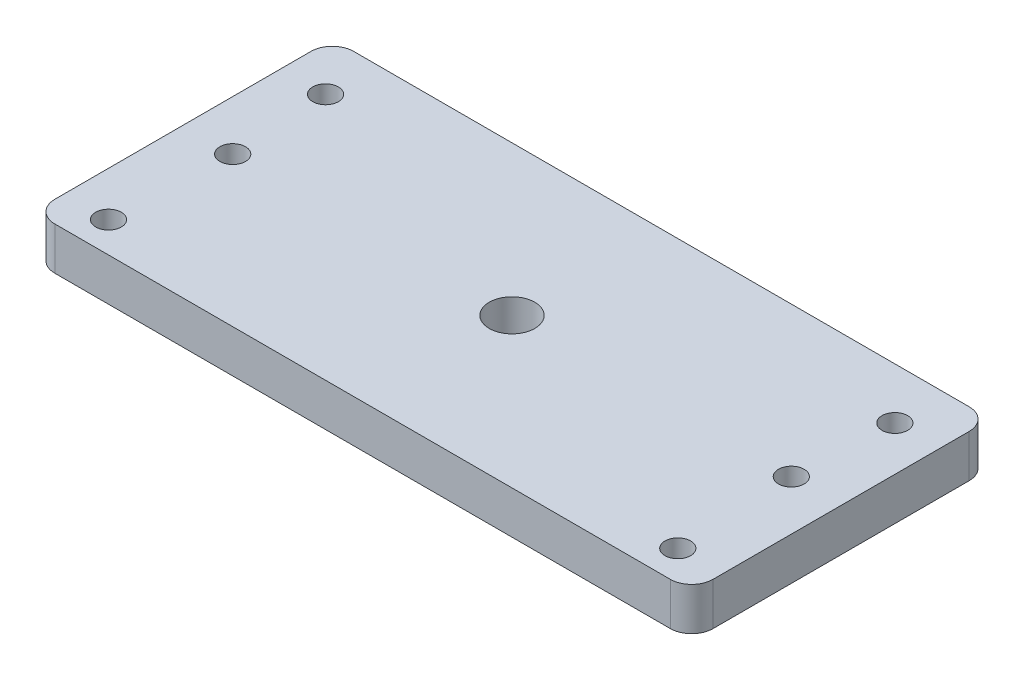
ISO-10303-21;
HEADER;
FILE_DESCRIPTION(('STEP AP214'),'2;1');
FILE_NAME('part.step','',(''),(''),'','','');
FILE_SCHEMA(('AUTOMOTIVE_DESIGN { 1 0 10303 214 1 1 1 1 }'));
ENDSEC;
DATA;
#1=APPLICATION_CONTEXT('core data for automotive mechanical design processes');
#2=APPLICATION_PROTOCOL_DEFINITION('international standard','automotive_design',2000,#1);
#3=PRODUCT_CONTEXT('',#1,'mechanical');
#4=PRODUCT('Part','Part','',(#3));
#5=PRODUCT_RELATED_PRODUCT_CATEGORY('part','',(#4));
#6=PRODUCT_DEFINITION_FORMATION('','',#4);
#7=PRODUCT_DEFINITION_CONTEXT('part definition',#1,'design');
#8=PRODUCT_DEFINITION('design','',#6,#7);
#9=PRODUCT_DEFINITION_SHAPE('','',#8);
#10=(LENGTH_UNIT() NAMED_UNIT(*) SI_UNIT(.MILLI.,.METRE.));
#11=(NAMED_UNIT(*) PLANE_ANGLE_UNIT() SI_UNIT($,.RADIAN.));
#12=(NAMED_UNIT(*) SI_UNIT($,.STERADIAN.) SOLID_ANGLE_UNIT());
#13=UNCERTAINTY_MEASURE_WITH_UNIT(LENGTH_MEASURE(1.E-05),#10,'distance_accuracy_value','');
#14=(GEOMETRIC_REPRESENTATION_CONTEXT(3) GLOBAL_UNCERTAINTY_ASSIGNED_CONTEXT((#13)) GLOBAL_UNIT_ASSIGNED_CONTEXT((#10,
#11,#12)) REPRESENTATION_CONTEXT('',''));
#15=CARTESIAN_POINT('',(0.,0.,0.));
#16=DIRECTION('',(0.,0.,1.));
#17=DIRECTION('',(1.,0.,0.));
#18=AXIS2_PLACEMENT_3D('',#15,#16,#17);
#19=CARTESIAN_POINT('',(0.,0.,0.));
#20=DIRECTION('',(0.,1.,0.));
#21=DIRECTION('',(0.,0.,1.));
#22=AXIS2_PLACEMENT_3D('',#19,#20,#21);
#23=PLANE('',#22);
#24=CARTESIAN_POINT('',(59.5033388859809,0.,-13.7153435773295));
#25=DIRECTION('',(0.,-1.,0.));
#26=DIRECTION('',(0.,0.,-1.));
#27=AXIS2_PLACEMENT_3D('',#24,#25,#26);
#28=CIRCLE('',#27,3.46999999999999);
#29=CARTESIAN_POINT('',(59.5033388859809,0.,-17.1853435773295));
#30=VERTEX_POINT('',#29);
#31=EDGE_CURVE('E234',#30,#30,#28,.T.);
#32=ORIENTED_EDGE('',*,*,#31,.F.);
#33=EDGE_LOOP('',(#32));
#34=FACE_BOUND('',#33,.T.);
#35=CARTESIAN_POINT('',(-18.9966611140192,0.,-13.7153435773295));
#36=DIRECTION('',(0.,-1.,0.));
#37=DIRECTION('',(0.,0.,-1.));
#38=AXIS2_PLACEMENT_3D('',#35,#36,#37);
#39=CIRCLE('',#38,3.47);
#40=CARTESIAN_POINT('',(-18.9966611140192,0.,-17.1853435773295));
#41=VERTEX_POINT('',#40);
#42=EDGE_CURVE('E225',#41,#41,#39,.T.);
#43=ORIENTED_EDGE('',*,*,#42,.F.);
#44=EDGE_LOOP('',(#43));
#45=FACE_BOUND('',#44,.T.);
#46=CARTESIAN_POINT('',(20.2533388859809,0.,-13.7153435773295));
#47=DIRECTION('',(0.,1.,0.));
#48=DIRECTION('',(0.,0.,1.));
#49=AXIS2_PLACEMENT_3D('',#46,#47,#48);
#50=CIRCLE('',#49,10.2);
#51=CARTESIAN_POINT('',(20.2533388859809,0.,-3.51534357732952));
#52=VERTEX_POINT('',#51);
#53=EDGE_CURVE('E149',#52,#52,#50,.T.);
#54=ORIENTED_EDGE('',*,*,#53,.T.);
#55=EDGE_LOOP('',(#54));
#56=FACE_BOUND('',#55,.T.);
#57=DIRECTION('',(0.,0.,1.));
#58=VECTOR('',#57,1.);
#59=CARTESIAN_POINT('',(-25.9966611140191,0.,-34.7153435773295));
#60=LINE('',#59,#58);
#61=CARTESIAN_POINT('',(-25.9966611140191,0.,-31.7153435773295));
#62=VERTEX_POINT('',#61);
#63=CARTESIAN_POINT('',(-25.9966611140191,0.,4.28465642267049));
#64=VERTEX_POINT('',#63);
#65=EDGE_CURVE('E124',#62,#64,#60,.T.);
#66=ORIENTED_EDGE('',*,*,#65,.F.);
#67=CARTESIAN_POINT('',(-22.9966611140191,0.,-31.7153435773295));
#68=DIRECTION('',(0.,1.,0.));
#69=DIRECTION('',(0.,0.,1.));
#70=AXIS2_PLACEMENT_3D('',#67,#68,#69);
#71=CIRCLE('',#70,3.);
#72=CARTESIAN_POINT('',(-22.9966611140191,0.,-34.7153435773295));
#73=VERTEX_POINT('',#72);
#74=EDGE_CURVE('E107',#62,#73,#71,.F.);
#75=ORIENTED_EDGE('',*,*,#74,.T.);
#76=DIRECTION('',(-1.,0.,0.));
#77=VECTOR('',#76,1.);
#78=CARTESIAN_POINT('',(-25.9966611140191,0.,-34.7153435773295));
#79=LINE('',#78,#77);
#80=CARTESIAN_POINT('',(63.5033388859809,0.,-34.7153435773295));
#81=VERTEX_POINT('',#80);
#82=EDGE_CURVE('E147',#81,#73,#79,.T.);
#83=ORIENTED_EDGE('',*,*,#82,.F.);
#84=CARTESIAN_POINT('',(63.5033388859809,0.,-31.7153435773295));
#85=DIRECTION('',(0.,1.,0.));
#86=DIRECTION('',(0.,0.,1.));
#87=AXIS2_PLACEMENT_3D('',#84,#85,#86);
#88=CIRCLE('',#87,3.);
#89=CARTESIAN_POINT('',(66.5033388859809,0.,-31.7153435773295));
#90=VERTEX_POINT('',#89);
#91=EDGE_CURVE('E128',#81,#90,#88,.F.);
#92=ORIENTED_EDGE('',*,*,#91,.T.);
#93=DIRECTION('',(0.,0.,-1.));
#94=VECTOR('',#93,1.);
#95=CARTESIAN_POINT('',(66.5033388859809,0.,-34.7153435773295));
#96=LINE('',#95,#94);
#97=CARTESIAN_POINT('',(66.5033388859809,0.,4.28465642267048));
#98=VERTEX_POINT('',#97);
#99=EDGE_CURVE('E137',#98,#90,#96,.T.);
#100=ORIENTED_EDGE('',*,*,#99,.F.);
#101=CARTESIAN_POINT('',(63.5033388859809,0.,4.28465642267048));
#102=DIRECTION('',(0.,1.,0.));
#103=DIRECTION('',(0.,0.,1.));
#104=AXIS2_PLACEMENT_3D('',#101,#102,#103);
#105=CIRCLE('',#104,3.);
#106=CARTESIAN_POINT('',(63.5033388859809,0.,7.28465642267049));
#107=VERTEX_POINT('',#106);
#108=EDGE_CURVE('E154',#98,#107,#105,.F.);
#109=ORIENTED_EDGE('',*,*,#108,.T.);
#110=DIRECTION('',(1.,0.,0.));
#111=VECTOR('',#110,1.);
#112=CARTESIAN_POINT('',(-25.9966611140191,0.,7.2846564226705));
#113=LINE('',#112,#111);
#114=CARTESIAN_POINT('',(-22.9966611140191,0.,7.2846564226705));
#115=VERTEX_POINT('',#114);
#116=EDGE_CURVE('E133',#115,#107,#113,.T.);
#117=ORIENTED_EDGE('',*,*,#116,.F.);
#118=CARTESIAN_POINT('',(-22.9966611140191,0.,4.2846564226705));
#119=DIRECTION('',(0.,1.,0.));
#120=DIRECTION('',(0.,0.,1.));
#121=AXIS2_PLACEMENT_3D('',#118,#119,#120);
#122=CIRCLE('',#121,3.);
#123=EDGE_CURVE('E118',#115,#64,#122,.F.);
#124=ORIENTED_EDGE('',*,*,#123,.T.);
#125=EDGE_LOOP('',(#66,#75,#83,#92,#100,#109,#117,#124));
#126=FACE_BOUND('',#125,.T.);
#127=CARTESIAN_POINT('',(-19.746661114016,0.,-27.5153435773319));
#128=DIRECTION('',(0.,-1.,0.));
#129=DIRECTION('',(0.,0.,-1.));
#130=AXIS2_PLACEMENT_3D('',#127,#128,#129);
#131=CIRCLE('',#130,1.8);
#132=CARTESIAN_POINT('',(-19.746661114016,0.,-29.3153435773319));
#133=VERTEX_POINT('',#132);
#134=EDGE_CURVE('E192',#133,#133,#131,.T.);
#135=ORIENTED_EDGE('',*,*,#134,.F.);
#136=EDGE_LOOP('',(#135));
#137=FACE_BOUND('',#136,.T.);
#138=CARTESIAN_POINT('',(-19.7466611140159,0.,2.98465642266812));
#139=DIRECTION('',(0.,-1.,0.));
#140=DIRECTION('',(0.,0.,-1.));
#141=AXIS2_PLACEMENT_3D('',#138,#139,#140);
#142=CIRCLE('',#141,1.8);
#143=CARTESIAN_POINT('',(-19.7466611140159,0.,1.18465642266812));
#144=VERTEX_POINT('',#143);
#145=EDGE_CURVE('E198',#144,#144,#142,.T.);
#146=ORIENTED_EDGE('',*,*,#145,.F.);
#147=EDGE_LOOP('',(#146));
#148=FACE_BOUND('',#147,.T.);
#149=CARTESIAN_POINT('',(60.2533388859841,0.,2.98465642266775));
#150=DIRECTION('',(0.,-1.,0.));
#151=DIRECTION('',(0.,0.,-1.));
#152=AXIS2_PLACEMENT_3D('',#149,#150,#151);
#153=CIRCLE('',#152,1.8);
#154=CARTESIAN_POINT('',(60.2533388859841,0.,1.18465642266775));
#155=VERTEX_POINT('',#154);
#156=EDGE_CURVE('E204',#155,#155,#153,.T.);
#157=ORIENTED_EDGE('',*,*,#156,.F.);
#158=EDGE_LOOP('',(#157));
#159=FACE_BOUND('',#158,.T.);
#160=CARTESIAN_POINT('',(60.253338885984,0.,-27.5153435773322));
#161=DIRECTION('',(0.,-1.,0.));
#162=DIRECTION('',(0.,0.,-1.));
#163=AXIS2_PLACEMENT_3D('',#160,#161,#162);
#164=CIRCLE('',#163,1.8);
#165=CARTESIAN_POINT('',(60.253338885984,0.,-29.3153435773322));
#166=VERTEX_POINT('',#165);
#167=EDGE_CURVE('E210',#166,#166,#164,.T.);
#168=ORIENTED_EDGE('',*,*,#167,.F.);
#169=EDGE_LOOP('',(#168));
#170=FACE_BOUND('',#169,.T.);
#171=ADVANCED_FACE('F41',(#34,#45,#56,#126,#137,#148,#159,#170),#23,.F.);
#172=CARTESIAN_POINT('',(0.,6.,0.));
#173=DIRECTION('',(0.,1.,0.));
#174=DIRECTION('',(0.,0.,1.));
#175=AXIS2_PLACEMENT_3D('',#172,#173,#174);
#176=PLANE('',#175);
#177=CARTESIAN_POINT('',(59.5033388859809,6.,-13.7153435773295));
#178=DIRECTION('',(0.,-1.,0.));
#179=DIRECTION('',(0.,0.,-1.));
#180=AXIS2_PLACEMENT_3D('',#177,#178,#179);
#181=CIRCLE('',#180,1.8);
#182=CARTESIAN_POINT('',(59.5033388859809,6.,-15.5153435773295));
#183=VERTEX_POINT('',#182);
#184=EDGE_CURVE('E228',#183,#183,#181,.T.);
#185=ORIENTED_EDGE('',*,*,#184,.T.);
#186=EDGE_LOOP('',(#185));
#187=FACE_BOUND('',#186,.T.);
#188=CARTESIAN_POINT('',(-18.9966611140192,6.,-13.7153435773295));
#189=DIRECTION('',(0.,-1.,0.));
#190=DIRECTION('',(0.,0.,-1.));
#191=AXIS2_PLACEMENT_3D('',#188,#189,#190);
#192=CIRCLE('',#191,1.8);
#193=CARTESIAN_POINT('',(-18.9966611140192,6.,-15.5153435773295));
#194=VERTEX_POINT('',#193);
#195=EDGE_CURVE('E219',#194,#194,#192,.T.);
#196=ORIENTED_EDGE('',*,*,#195,.T.);
#197=EDGE_LOOP('',(#196));
#198=FACE_BOUND('',#197,.T.);
#199=CARTESIAN_POINT('',(60.253338885984,6.,-27.5153435773322));
#200=DIRECTION('',(0.,1.,0.));
#201=DIRECTION('',(0.,0.,1.));
#202=AXIS2_PLACEMENT_3D('',#199,#200,#201);
#203=CIRCLE('',#202,1.8);
#204=CARTESIAN_POINT('',(60.253338885984,6.,-25.7153435773322));
#205=VERTEX_POINT('',#204);
#206=EDGE_CURVE('E207',#205,#205,#203,.T.);
#207=ORIENTED_EDGE('',*,*,#206,.F.);
#208=EDGE_LOOP('',(#207));
#209=FACE_BOUND('',#208,.T.);
#210=CARTESIAN_POINT('',(60.2533388859841,6.,2.98465642266775));
#211=DIRECTION('',(0.,1.,0.));
#212=DIRECTION('',(0.,0.,1.));
#213=AXIS2_PLACEMENT_3D('',#210,#211,#212);
#214=CIRCLE('',#213,1.8);
#215=CARTESIAN_POINT('',(60.2533388859841,6.,4.78465642266775));
#216=VERTEX_POINT('',#215);
#217=EDGE_CURVE('E201',#216,#216,#214,.T.);
#218=ORIENTED_EDGE('',*,*,#217,.F.);
#219=EDGE_LOOP('',(#218));
#220=FACE_BOUND('',#219,.T.);
#221=CARTESIAN_POINT('',(-19.7466611140159,6.,2.98465642266812));
#222=DIRECTION('',(0.,1.,0.));
#223=DIRECTION('',(0.,0.,1.));
#224=AXIS2_PLACEMENT_3D('',#221,#222,#223);
#225=CIRCLE('',#224,1.8);
#226=CARTESIAN_POINT('',(-19.7466611140159,6.,4.78465642266812));
#227=VERTEX_POINT('',#226);
#228=EDGE_CURVE('E195',#227,#227,#225,.T.);
#229=ORIENTED_EDGE('',*,*,#228,.F.);
#230=EDGE_LOOP('',(#229));
#231=FACE_BOUND('',#230,.T.);
#232=CARTESIAN_POINT('',(-19.746661114016,6.,-27.5153435773319));
#233=DIRECTION('',(0.,1.,0.));
#234=DIRECTION('',(0.,0.,1.));
#235=AXIS2_PLACEMENT_3D('',#232,#233,#234);
#236=CIRCLE('',#235,1.8);
#237=CARTESIAN_POINT('',(-19.746661114016,6.,-25.7153435773319));
#238=VERTEX_POINT('',#237);
#239=EDGE_CURVE('E140',#238,#238,#236,.T.);
#240=ORIENTED_EDGE('',*,*,#239,.F.);
#241=EDGE_LOOP('',(#240));
#242=FACE_BOUND('',#241,.T.);
#243=DIRECTION('',(-1.,0.,0.));
#244=VECTOR('',#243,1.);
#245=CARTESIAN_POINT('',(-25.9966611140191,6.,-34.7153435773295));
#246=LINE('',#245,#244);
#247=CARTESIAN_POINT('',(63.5033388859809,6.,-34.7153435773295));
#248=VERTEX_POINT('',#247);
#249=CARTESIAN_POINT('',(-22.9966611140191,6.,-34.7153435773295));
#250=VERTEX_POINT('',#249);
#251=EDGE_CURVE('E143',#248,#250,#246,.T.);
#252=ORIENTED_EDGE('',*,*,#251,.T.);
#253=CARTESIAN_POINT('',(-22.9966611140191,6.,-31.7153435773295));
#254=DIRECTION('',(0.,1.,0.));
#255=DIRECTION('',(0.,0.,1.));
#256=AXIS2_PLACEMENT_3D('',#253,#254,#255);
#257=CIRCLE('',#256,3.);
#258=CARTESIAN_POINT('',(-25.9966611140191,6.,-31.7153435773295));
#259=VERTEX_POINT('',#258);
#260=EDGE_CURVE('E165',#250,#259,#257,.T.);
#261=ORIENTED_EDGE('',*,*,#260,.T.);
#262=DIRECTION('',(0.,0.,1.));
#263=VECTOR('',#262,1.);
#264=CARTESIAN_POINT('',(-25.9966611140191,6.,-34.7153435773295));
#265=LINE('',#264,#263);
#266=CARTESIAN_POINT('',(-25.9966611140191,6.,4.28465642267049));
#267=VERTEX_POINT('',#266);
#268=EDGE_CURVE('E127',#259,#267,#265,.T.);
#269=ORIENTED_EDGE('',*,*,#268,.T.);
#270=CARTESIAN_POINT('',(-22.9966611140191,6.,4.2846564226705));
#271=DIRECTION('',(0.,1.,0.));
#272=DIRECTION('',(0.,0.,1.));
#273=AXIS2_PLACEMENT_3D('',#270,#271,#272);
#274=CIRCLE('',#273,3.);
#275=CARTESIAN_POINT('',(-22.9966611140191,6.,7.2846564226705));
#276=VERTEX_POINT('',#275);
#277=EDGE_CURVE('E163',#267,#276,#274,.T.);
#278=ORIENTED_EDGE('',*,*,#277,.T.);
#279=DIRECTION('',(1.,0.,0.));
#280=VECTOR('',#279,1.);
#281=CARTESIAN_POINT('',(-25.9966611140191,6.,7.2846564226705));
#282=LINE('',#281,#280);
#283=CARTESIAN_POINT('',(63.5033388859809,6.,7.28465642267049));
#284=VERTEX_POINT('',#283);
#285=EDGE_CURVE('E176',#276,#284,#282,.T.);
#286=ORIENTED_EDGE('',*,*,#285,.T.);
#287=CARTESIAN_POINT('',(63.5033388859809,6.,4.28465642267048));
#288=DIRECTION('',(0.,1.,0.));
#289=DIRECTION('',(0.,0.,1.));
#290=AXIS2_PLACEMENT_3D('',#287,#288,#289);
#291=CIRCLE('',#290,3.);
#292=CARTESIAN_POINT('',(66.5033388859809,6.,4.28465642267048));
#293=VERTEX_POINT('',#292);
#294=EDGE_CURVE('E62',#284,#293,#291,.T.);
#295=ORIENTED_EDGE('',*,*,#294,.T.);
#296=DIRECTION('',(0.,0.,-1.));
#297=VECTOR('',#296,1.);
#298=CARTESIAN_POINT('',(66.5033388859809,6.,-34.7153435773295));
#299=LINE('',#298,#297);
#300=CARTESIAN_POINT('',(66.5033388859809,6.,-31.7153435773295));
#301=VERTEX_POINT('',#300);
#302=EDGE_CURVE('E184',#293,#301,#299,.T.);
#303=ORIENTED_EDGE('',*,*,#302,.T.);
#304=CARTESIAN_POINT('',(63.5033388859809,6.,-31.7153435773295));
#305=DIRECTION('',(0.,1.,0.));
#306=DIRECTION('',(0.,0.,1.));
#307=AXIS2_PLACEMENT_3D('',#304,#305,#306);
#308=CIRCLE('',#307,3.);
#309=EDGE_CURVE('E160',#301,#248,#308,.T.);
#310=ORIENTED_EDGE('',*,*,#309,.T.);
#311=EDGE_LOOP('',(#252,#261,#269,#278,#286,#295,#303,#310));
#312=FACE_BOUND('',#311,.T.);
#313=CARTESIAN_POINT('',(20.2533388859809,6.,-13.7153435773295));
#314=DIRECTION('',(0.,1.,0.));
#315=DIRECTION('',(0.,0.,1.));
#316=AXIS2_PLACEMENT_3D('',#313,#314,#315);
#317=CIRCLE('',#316,3.2);
#318=CARTESIAN_POINT('',(20.2533388859809,6.,-10.5153435773295));
#319=VERTEX_POINT('',#318);
#320=EDGE_CURVE('E134',#319,#319,#317,.T.);
#321=ORIENTED_EDGE('',*,*,#320,.F.);
#322=EDGE_LOOP('',(#321));
#323=FACE_BOUND('',#322,.T.);
#324=ADVANCED_FACE('F242',(#187,#198,#209,#220,#231,#242,#312,#323),#176,.T.);
#325=CARTESIAN_POINT('',(-25.9966611140191,6.,-34.7153435773295));
#326=DIRECTION('',(1.,0.,0.));
#327=DIRECTION('',(0.,0.,-1.));
#328=AXIS2_PLACEMENT_3D('',#325,#326,#327);
#329=PLANE('',#328);
#330=ORIENTED_EDGE('',*,*,#268,.F.);
#331=DIRECTION('',(0.,-1.,0.));
#332=VECTOR('',#331,1.);
#333=CARTESIAN_POINT('',(-25.9966611140191,6.,-31.7153435773295));
#334=LINE('',#333,#332);
#335=EDGE_CURVE('E111',#259,#62,#334,.T.);
#336=ORIENTED_EDGE('',*,*,#335,.T.);
#337=ORIENTED_EDGE('',*,*,#65,.T.);
#338=DIRECTION('',(0.,-1.,0.));
#339=VECTOR('',#338,1.);
#340=CARTESIAN_POINT('',(-25.9966611140191,6.,4.28465642267049));
#341=LINE('',#340,#339);
#342=EDGE_CURVE('E129',#64,#267,#341,.F.);
#343=ORIENTED_EDGE('',*,*,#342,.T.);
#344=EDGE_LOOP('',(#330,#336,#337,#343));
#345=FACE_BOUND('',#344,.T.);
#346=ADVANCED_FACE('F123',(#345),#329,.F.);
#347=CARTESIAN_POINT('',(-25.9966611140191,6.,7.2846564226705));
#348=DIRECTION('',(0.,0.,-1.));
#349=DIRECTION('',(-1.,0.,0.));
#350=AXIS2_PLACEMENT_3D('',#347,#348,#349);
#351=PLANE('',#350);
#352=ORIENTED_EDGE('',*,*,#285,.F.);
#353=DIRECTION('',(0.,-1.,0.));
#354=VECTOR('',#353,1.);
#355=CARTESIAN_POINT('',(-22.9966611140191,6.,7.2846564226705));
#356=LINE('',#355,#354);
#357=EDGE_CURVE('E169',#276,#115,#356,.T.);
#358=ORIENTED_EDGE('',*,*,#357,.T.);
#359=ORIENTED_EDGE('',*,*,#116,.T.);
#360=DIRECTION('',(0.,-1.,0.));
#361=VECTOR('',#360,1.);
#362=CARTESIAN_POINT('',(63.5033388859809,6.,7.28465642267049));
#363=LINE('',#362,#361);
#364=EDGE_CURVE('E167',#107,#284,#363,.F.);
#365=ORIENTED_EDGE('',*,*,#364,.T.);
#366=EDGE_LOOP('',(#352,#358,#359,#365));
#367=FACE_BOUND('',#366,.T.);
#368=ADVANCED_FACE('F174',(#367),#351,.F.);
#369=CARTESIAN_POINT('',(66.5033388859809,6.,-34.7153435773295));
#370=DIRECTION('',(-1.,0.,0.));
#371=DIRECTION('',(0.,0.,1.));
#372=AXIS2_PLACEMENT_3D('',#369,#370,#371);
#373=PLANE('',#372);
#374=ORIENTED_EDGE('',*,*,#302,.F.);
#375=DIRECTION('',(0.,-1.,0.));
#376=VECTOR('',#375,1.);
#377=CARTESIAN_POINT('',(66.5033388859809,6.,4.28465642267048));
#378=LINE('',#377,#376);
#379=EDGE_CURVE('E11',#293,#98,#378,.T.);
#380=ORIENTED_EDGE('',*,*,#379,.T.);
#381=ORIENTED_EDGE('',*,*,#99,.T.);
#382=DIRECTION('',(0.,-1.,0.));
#383=VECTOR('',#382,1.);
#384=CARTESIAN_POINT('',(66.5033388859809,6.,-31.7153435773295));
#385=LINE('',#384,#383);
#386=EDGE_CURVE('E49',#90,#301,#385,.F.);
#387=ORIENTED_EDGE('',*,*,#386,.T.);
#388=EDGE_LOOP('',(#374,#380,#381,#387));
#389=FACE_BOUND('',#388,.T.);
#390=ADVANCED_FACE('F183',(#389),#373,.F.);
#391=CARTESIAN_POINT('',(-25.9966611140191,6.,-34.7153435773295));
#392=DIRECTION('',(0.,0.,1.));
#393=DIRECTION('',(1.,0.,0.));
#394=AXIS2_PLACEMENT_3D('',#391,#392,#393);
#395=PLANE('',#394);
#396=ORIENTED_EDGE('',*,*,#82,.T.);
#397=DIRECTION('',(0.,-1.,0.));
#398=VECTOR('',#397,1.);
#399=CARTESIAN_POINT('',(-22.9966611140191,6.,-34.7153435773295));
#400=LINE('',#399,#398);
#401=EDGE_CURVE('E112',#73,#250,#400,.F.);
#402=ORIENTED_EDGE('',*,*,#401,.T.);
#403=ORIENTED_EDGE('',*,*,#251,.F.);
#404=DIRECTION('',(0.,-1.,0.));
#405=VECTOR('',#404,1.);
#406=CARTESIAN_POINT('',(63.5033388859809,6.,-34.7153435773295));
#407=LINE('',#406,#405);
#408=EDGE_CURVE('E117',#248,#81,#407,.T.);
#409=ORIENTED_EDGE('',*,*,#408,.T.);
#410=EDGE_LOOP('',(#396,#402,#403,#409));
#411=FACE_BOUND('',#410,.T.);
#412=ADVANCED_FACE('F264',(#411),#395,.F.);
#413=CARTESIAN_POINT('',(20.2533388859809,6.,-13.7153435773295));
#414=DIRECTION('',(0.,-1.,0.));
#415=DIRECTION('',(0.,0.,-1.));
#416=AXIS2_PLACEMENT_3D('',#413,#414,#415);
#417=CYLINDRICAL_SURFACE('',#416,3.2);
#418=ORIENTED_EDGE('',*,*,#320,.T.);
#419=EDGE_LOOP('',(#418));
#420=FACE_BOUND('',#419,.T.);
#421=CARTESIAN_POINT('',(20.2533388859809,-3.,-13.7153435773295));
#422=DIRECTION('',(0.,-1.,0.));
#423=DIRECTION('',(0.,0.,-1.));
#424=AXIS2_PLACEMENT_3D('',#421,#422,#423);
#425=CIRCLE('',#424,3.2);
#426=CARTESIAN_POINT('',(20.2533388859809,-3.,-16.9153435773295));
#427=VERTEX_POINT('',#426);
#428=EDGE_CURVE('E216',#427,#427,#425,.T.);
#429=ORIENTED_EDGE('',*,*,#428,.T.);
#430=EDGE_LOOP('',(#429));
#431=FACE_BOUND('',#430,.T.);
#432=ADVANCED_FACE('F261',(#420,#431),#417,.F.);
#433=CARTESIAN_POINT('',(-19.746661114016,0.,-27.5153435773319));
#434=DIRECTION('',(0.,-1.,0.));
#435=DIRECTION('',(0.,0.,-1.));
#436=AXIS2_PLACEMENT_3D('',#433,#434,#435);
#437=CYLINDRICAL_SURFACE('',#436,1.8);
#438=ORIENTED_EDGE('',*,*,#239,.T.);
#439=EDGE_LOOP('',(#438));
#440=FACE_BOUND('',#439,.T.);
#441=ORIENTED_EDGE('',*,*,#134,.T.);
#442=EDGE_LOOP('',(#441));
#443=FACE_BOUND('',#442,.T.);
#444=ADVANCED_FACE('F263',(#440,#443),#437,.F.);
#445=CARTESIAN_POINT('',(-19.7466611140159,0.,2.98465642266812));
#446=DIRECTION('',(0.,-1.,0.));
#447=DIRECTION('',(0.,0.,-1.));
#448=AXIS2_PLACEMENT_3D('',#445,#446,#447);
#449=CYLINDRICAL_SURFACE('',#448,1.8);
#450=ORIENTED_EDGE('',*,*,#228,.T.);
#451=EDGE_LOOP('',(#450));
#452=FACE_BOUND('',#451,.T.);
#453=ORIENTED_EDGE('',*,*,#145,.T.);
#454=EDGE_LOOP('',(#453));
#455=FACE_BOUND('',#454,.T.);
#456=ADVANCED_FACE('F271',(#452,#455),#449,.F.);
#457=CARTESIAN_POINT('',(60.2533388859841,0.,2.98465642266775));
#458=DIRECTION('',(0.,-1.,0.));
#459=DIRECTION('',(0.,0.,-1.));
#460=AXIS2_PLACEMENT_3D('',#457,#458,#459);
#461=CYLINDRICAL_SURFACE('',#460,1.8);
#462=ORIENTED_EDGE('',*,*,#217,.T.);
#463=EDGE_LOOP('',(#462));
#464=FACE_BOUND('',#463,.T.);
#465=ORIENTED_EDGE('',*,*,#156,.T.);
#466=EDGE_LOOP('',(#465));
#467=FACE_BOUND('',#466,.T.);
#468=ADVANCED_FACE('F322',(#464,#467),#461,.F.);
#469=CARTESIAN_POINT('',(60.253338885984,0.,-27.5153435773322));
#470=DIRECTION('',(0.,-1.,0.));
#471=DIRECTION('',(0.,0.,-1.));
#472=AXIS2_PLACEMENT_3D('',#469,#470,#471);
#473=CYLINDRICAL_SURFACE('',#472,1.8);
#474=ORIENTED_EDGE('',*,*,#206,.T.);
#475=EDGE_LOOP('',(#474));
#476=FACE_BOUND('',#475,.T.);
#477=ORIENTED_EDGE('',*,*,#167,.T.);
#478=EDGE_LOOP('',(#477));
#479=FACE_BOUND('',#478,.T.);
#480=ADVANCED_FACE('F257',(#476,#479),#473,.F.);
#481=CARTESIAN_POINT('',(20.2533388859809,-3.,-13.7153435773295));
#482=DIRECTION('',(0.,-1.,0.));
#483=DIRECTION('',(0.,0.,-1.));
#484=AXIS2_PLACEMENT_3D('',#481,#482,#483);
#485=PLANE('',#484);
#486=CARTESIAN_POINT('',(20.2533388859809,-3.,-13.7153435773295));
#487=DIRECTION('',(0.,-1.,0.));
#488=DIRECTION('',(0.,0.,-1.));
#489=AXIS2_PLACEMENT_3D('',#486,#487,#488);
#490=CIRCLE('',#489,7.2);
#491=CARTESIAN_POINT('',(20.2533388859809,-3.,-20.9153435773295));
#492=VERTEX_POINT('',#491);
#493=EDGE_CURVE('E213',#492,#492,#490,.T.);
#494=ORIENTED_EDGE('',*,*,#493,.T.);
#495=EDGE_LOOP('',(#494));
#496=FACE_BOUND('',#495,.T.);
#497=ORIENTED_EDGE('',*,*,#428,.F.);
#498=EDGE_LOOP('',(#497));
#499=FACE_BOUND('',#498,.T.);
#500=ADVANCED_FACE('F251',(#496,#499),#485,.T.);
#501=CARTESIAN_POINT('',(20.2533388859809,-3.00000000000001,-13.7153435773295));
#502=DIRECTION('',(0.,1.,0.));
#503=DIRECTION('',(0.,0.,1.));
#504=AXIS2_PLACEMENT_3D('',#501,#502,#503);
#505=CONICAL_SURFACE('',#504,7.2,0.785398163397445);
#506=ORIENTED_EDGE('',*,*,#53,.F.);
#507=EDGE_LOOP('',(#506));
#508=FACE_BOUND('',#507,.T.);
#509=ORIENTED_EDGE('',*,*,#493,.F.);
#510=EDGE_LOOP('',(#509));
#511=FACE_BOUND('',#510,.T.);
#512=ADVANCED_FACE('F248',(#508,#511),#505,.T.);
#513=CARTESIAN_POINT('',(-22.9966611140191,6.,-31.7153435773295));
#514=DIRECTION('',(0.,-1.,0.));
#515=DIRECTION('',(0.,0.,-1.));
#516=AXIS2_PLACEMENT_3D('',#513,#514,#515);
#517=CYLINDRICAL_SURFACE('',#516,3.);
#518=ORIENTED_EDGE('',*,*,#260,.F.);
#519=ORIENTED_EDGE('',*,*,#401,.F.);
#520=ORIENTED_EDGE('',*,*,#74,.F.);
#521=ORIENTED_EDGE('',*,*,#335,.F.);
#522=EDGE_LOOP('',(#518,#519,#520,#521));
#523=FACE_BOUND('',#522,.T.);
#524=ADVANCED_FACE('F110',(#523),#517,.T.);
#525=CARTESIAN_POINT('',(-22.9966611140191,6.,4.2846564226705));
#526=DIRECTION('',(0.,-1.,0.));
#527=DIRECTION('',(0.,0.,-1.));
#528=AXIS2_PLACEMENT_3D('',#525,#526,#527);
#529=CYLINDRICAL_SURFACE('',#528,3.);
#530=ORIENTED_EDGE('',*,*,#277,.F.);
#531=ORIENTED_EDGE('',*,*,#342,.F.);
#532=ORIENTED_EDGE('',*,*,#123,.F.);
#533=ORIENTED_EDGE('',*,*,#357,.F.);
#534=EDGE_LOOP('',(#530,#531,#532,#533));
#535=FACE_BOUND('',#534,.T.);
#536=ADVANCED_FACE('F293',(#535),#529,.T.);
#537=CARTESIAN_POINT('',(63.5033388859809,6.,4.28465642267048));
#538=DIRECTION('',(0.,-1.,0.));
#539=DIRECTION('',(0.,0.,-1.));
#540=AXIS2_PLACEMENT_3D('',#537,#538,#539);
#541=CYLINDRICAL_SURFACE('',#540,3.);
#542=ORIENTED_EDGE('',*,*,#294,.F.);
#543=ORIENTED_EDGE('',*,*,#364,.F.);
#544=ORIENTED_EDGE('',*,*,#108,.F.);
#545=ORIENTED_EDGE('',*,*,#379,.F.);
#546=EDGE_LOOP('',(#542,#543,#544,#545));
#547=FACE_BOUND('',#546,.T.);
#548=ADVANCED_FACE('F182',(#547),#541,.T.);
#549=CARTESIAN_POINT('',(63.5033388859809,6.,-31.7153435773295));
#550=DIRECTION('',(0.,-1.,0.));
#551=DIRECTION('',(0.,0.,-1.));
#552=AXIS2_PLACEMENT_3D('',#549,#550,#551);
#553=CYLINDRICAL_SURFACE('',#552,3.);
#554=ORIENTED_EDGE('',*,*,#309,.F.);
#555=ORIENTED_EDGE('',*,*,#386,.F.);
#556=ORIENTED_EDGE('',*,*,#91,.F.);
#557=ORIENTED_EDGE('',*,*,#408,.F.);
#558=EDGE_LOOP('',(#554,#555,#556,#557));
#559=FACE_BOUND('',#558,.T.);
#560=ADVANCED_FACE('F43',(#559),#553,.T.);
#561=CARTESIAN_POINT('',(-18.9966611140192,0.,-13.7153435773295));
#562=DIRECTION('',(0.,-1.,0.));
#563=DIRECTION('',(0.,0.,-1.));
#564=AXIS2_PLACEMENT_3D('',#561,#562,#563);
#565=CYLINDRICAL_SURFACE('',#564,1.8);
#566=ORIENTED_EDGE('',*,*,#195,.F.);
#567=EDGE_LOOP('',(#566));
#568=FACE_BOUND('',#567,.T.);
#569=CARTESIAN_POINT('',(-18.9966611140192,1.67,-13.7153435773295));
#570=DIRECTION('',(0.,-1.,0.));
#571=DIRECTION('',(0.,0.,-1.));
#572=AXIS2_PLACEMENT_3D('',#569,#570,#571);
#573=CIRCLE('',#572,1.8);
#574=CARTESIAN_POINT('',(-18.9966611140192,1.67,-15.5153435773295));
#575=VERTEX_POINT('',#574);
#576=EDGE_CURVE('E222',#575,#575,#573,.T.);
#577=ORIENTED_EDGE('',*,*,#576,.T.);
#578=EDGE_LOOP('',(#577));
#579=FACE_BOUND('',#578,.T.);
#580=ADVANCED_FACE('F299',(#568,#579),#565,.F.);
#581=CARTESIAN_POINT('',(-18.9966611140192,0.,-13.7153435773295));
#582=DIRECTION('',(0.,-1.,0.));
#583=DIRECTION('',(0.,0.,-1.));
#584=AXIS2_PLACEMENT_3D('',#581,#582,#583);
#585=CONICAL_SURFACE('',#584,3.47,0.785398163397449);
#586=ORIENTED_EDGE('',*,*,#576,.F.);
#587=EDGE_LOOP('',(#586));
#588=FACE_BOUND('',#587,.T.);
#589=ORIENTED_EDGE('',*,*,#42,.T.);
#590=EDGE_LOOP('',(#589));
#591=FACE_BOUND('',#590,.T.);
#592=ADVANCED_FACE('F304',(#588,#591),#585,.F.);
#593=CARTESIAN_POINT('',(59.5033388859809,0.,-13.7153435773295));
#594=DIRECTION('',(0.,-1.,0.));
#595=DIRECTION('',(0.,0.,-1.));
#596=AXIS2_PLACEMENT_3D('',#593,#594,#595);
#597=CYLINDRICAL_SURFACE('',#596,1.8);
#598=ORIENTED_EDGE('',*,*,#184,.F.);
#599=EDGE_LOOP('',(#598));
#600=FACE_BOUND('',#599,.T.);
#601=CARTESIAN_POINT('',(59.5033388859809,1.67,-13.7153435773295));
#602=DIRECTION('',(0.,-1.,0.));
#603=DIRECTION('',(0.,0.,-1.));
#604=AXIS2_PLACEMENT_3D('',#601,#602,#603);
#605=CIRCLE('',#604,1.8);
#606=CARTESIAN_POINT('',(59.5033388859809,1.67,-15.5153435773295));
#607=VERTEX_POINT('',#606);
#608=EDGE_CURVE('E231',#607,#607,#605,.T.);
#609=ORIENTED_EDGE('',*,*,#608,.T.);
#610=EDGE_LOOP('',(#609));
#611=FACE_BOUND('',#610,.T.);
#612=ADVANCED_FACE('F314',(#600,#611),#597,.F.);
#613=CARTESIAN_POINT('',(59.5033388859809,0.,-13.7153435773295));
#614=DIRECTION('',(0.,-1.,0.));
#615=DIRECTION('',(0.,0.,-1.));
#616=AXIS2_PLACEMENT_3D('',#613,#614,#615);
#617=CONICAL_SURFACE('',#616,3.46999999999999,0.785398163397448);
#618=ORIENTED_EDGE('',*,*,#608,.F.);
#619=EDGE_LOOP('',(#618));
#620=FACE_BOUND('',#619,.T.);
#621=ORIENTED_EDGE('',*,*,#31,.T.);
#622=EDGE_LOOP('',(#621));
#623=FACE_BOUND('',#622,.T.);
#624=ADVANCED_FACE('F238',(#620,#623),#617,.F.);
#625=CLOSED_SHELL('',(#171,#324,#346,#368,#390,#412,#432,#444,#456,#468,#480,#500,#512,#524,
#536,#548,#560,#580,#592,#612,#624));
#626=MANIFOLD_SOLID_BREP('B2',#625);
#627=ADVANCED_BREP_SHAPE_REPRESENTATION('',(#18,#626),#14);
#628=SHAPE_DEFINITION_REPRESENTATION(#9,#627);
ENDSEC;
END-ISO-10303-21;
